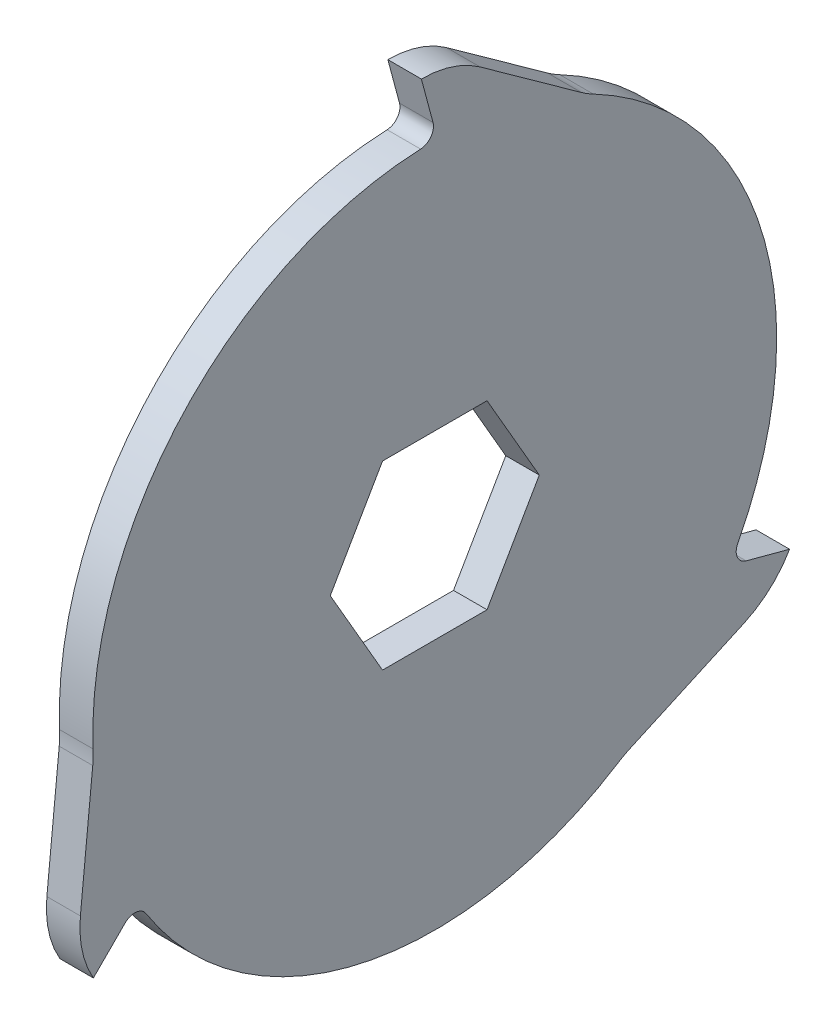
ISO-10303-21;
HEADER;
FILE_DESCRIPTION(('STEP AP214'),'2;1');
FILE_NAME('part.step','',(''),(''),'','','');
FILE_SCHEMA(('AUTOMOTIVE_DESIGN { 1 0 10303 214 1 1 1 1 }'));
ENDSEC;
DATA;
#1=APPLICATION_CONTEXT('core data for automotive mechanical design processes');
#2=APPLICATION_PROTOCOL_DEFINITION('international standard','automotive_design',2000,#1);
#3=PRODUCT_CONTEXT('',#1,'mechanical');
#4=PRODUCT('Part','Part','',(#3));
#5=PRODUCT_RELATED_PRODUCT_CATEGORY('part','',(#4));
#6=PRODUCT_DEFINITION_FORMATION('','',#4);
#7=PRODUCT_DEFINITION_CONTEXT('part definition',#1,'design');
#8=PRODUCT_DEFINITION('design','',#6,#7);
#9=PRODUCT_DEFINITION_SHAPE('','',#8);
#10=(LENGTH_UNIT() NAMED_UNIT(*) SI_UNIT(.MILLI.,.METRE.));
#11=(NAMED_UNIT(*) PLANE_ANGLE_UNIT() SI_UNIT($,.RADIAN.));
#12=(NAMED_UNIT(*) SI_UNIT($,.STERADIAN.) SOLID_ANGLE_UNIT());
#13=UNCERTAINTY_MEASURE_WITH_UNIT(LENGTH_MEASURE(1.E-05),#10,'distance_accuracy_value','');
#14=(GEOMETRIC_REPRESENTATION_CONTEXT(3) GLOBAL_UNCERTAINTY_ASSIGNED_CONTEXT((#13)) GLOBAL_UNIT_ASSIGNED_CONTEXT((#10,
#11,#12)) REPRESENTATION_CONTEXT('',''));
#15=CARTESIAN_POINT('',(0.,0.,0.));
#16=DIRECTION('',(0.,0.,1.));
#17=DIRECTION('',(1.,0.,0.));
#18=AXIS2_PLACEMENT_3D('',#15,#16,#17);
#19=CARTESIAN_POINT('',(2.5,0.,0.));
#20=DIRECTION('',(-1.,0.,0.));
#21=DIRECTION('',(0.,0.,1.));
#22=AXIS2_PLACEMENT_3D('',#19,#20,#21);
#23=CYLINDRICAL_SURFACE('',#22,51.);
#24=DIRECTION('',(1.,0.,0.));
#25=VECTOR('',#24,1.);
#26=CARTESIAN_POINT('',(-2.5,-23.6493995953492,-45.1852398331523));
#27=LINE('',#26,#25);
#28=CARTESIAN_POINT('',(-2.5,-23.6493995953492,-45.1852398331523));
#29=VERTEX_POINT('',#28);
#30=CARTESIAN_POINT('',(2.5,-23.6493995953492,-45.1852398331523));
#31=VERTEX_POINT('',#30);
#32=EDGE_CURVE('E248',#29,#31,#27,.T.);
#33=ORIENTED_EDGE('',*,*,#32,.F.);
#34=CARTESIAN_POINT('',(-2.5,0.,0.));
#35=DIRECTION('',(1.,0.,0.));
#36=DIRECTION('',(0.,0.,-1.));
#37=AXIS2_PLACEMENT_3D('',#34,#35,#36);
#38=CIRCLE('',#37,51.);
#39=CARTESIAN_POINT('',(-2.5,45.1852398331523,-23.6493995953494));
#40=VERTEX_POINT('',#39);
#41=EDGE_CURVE('E377',#29,#40,#38,.T.);
#42=ORIENTED_EDGE('',*,*,#41,.T.);
#43=DIRECTION('',(1.,0.,0.));
#44=VECTOR('',#43,1.);
#45=CARTESIAN_POINT('',(-2.5,45.1852398331523,-23.6493995953494));
#46=LINE('',#45,#44);
#47=CARTESIAN_POINT('',(2.5,45.1852398331523,-23.6493995953494));
#48=VERTEX_POINT('',#47);
#49=EDGE_CURVE('E326',#40,#48,#46,.T.);
#50=ORIENTED_EDGE('',*,*,#49,.T.);
#51=CARTESIAN_POINT('',(2.5,0.,0.));
#52=DIRECTION('',(1.,0.,0.));
#53=DIRECTION('',(0.,0.,-1.));
#54=AXIS2_PLACEMENT_3D('',#51,#52,#53);
#55=CIRCLE('',#54,51.);
#56=EDGE_CURVE('E43',#31,#48,#55,.T.);
#57=ORIENTED_EDGE('',*,*,#56,.F.);
#58=EDGE_LOOP('',(#33,#42,#50,#57));
#59=FACE_BOUND('',#58,.T.);
#60=ADVANCED_FACE('F33',(#59),#23,.T.);
#61=CARTESIAN_POINT('',(-2.5,-27.3068657739276,43.0736007503981));
#62=VERTEX_POINT('',#61);
#63=CARTESIAN_POINT('',(-2.5,-43.0736007503979,-27.3068657739281));
#64=VERTEX_POINT('',#63);
#65=EDGE_CURVE('E380',#62,#64,#38,.T.);
#66=ORIENTED_EDGE('',*,*,#65,.T.);
#67=DIRECTION('',(1.,0.,0.));
#68=VECTOR('',#67,1.);
#69=CARTESIAN_POINT('',(-2.5,-43.0736007503979,-27.3068657739281));
#70=LINE('',#69,#68);
#71=CARTESIAN_POINT('',(2.5,-43.0736007503979,-27.3068657739281));
#72=VERTEX_POINT('',#71);
#73=EDGE_CURVE('E57',#64,#72,#70,.T.);
#74=ORIENTED_EDGE('',*,*,#73,.T.);
#75=CARTESIAN_POINT('',(2.5,-27.3068657739276,43.0736007503981));
#76=VERTEX_POINT('',#75);
#77=EDGE_CURVE('E42',#76,#72,#55,.T.);
#78=ORIENTED_EDGE('',*,*,#77,.F.);
#79=DIRECTION('',(1.,0.,0.));
#80=VECTOR('',#79,1.);
#81=CARTESIAN_POINT('',(-2.5,-27.3068657739276,43.0736007503981));
#82=LINE('',#81,#80);
#83=EDGE_CURVE('E287',#62,#76,#82,.T.);
#84=ORIENTED_EDGE('',*,*,#83,.F.);
#85=EDGE_LOOP('',(#66,#74,#78,#84));
#86=FACE_BOUND('',#85,.T.);
#87=ADVANCED_FACE('F402',(#86),#23,.T.);
#88=CARTESIAN_POINT('',(2.5,0.,0.));
#89=DIRECTION('',(1.,0.,0.));
#90=DIRECTION('',(0.,0.,-1.));
#91=AXIS2_PLACEMENT_3D('',#88,#89,#90);
#92=PLANE('',#91);
#93=CARTESIAN_POINT('',(2.5,50.9562653692771,2.11163908275383));
#94=VERTEX_POINT('',#93);
#95=CARTESIAN_POINT('',(2.5,-2.11163908275438,50.9562653692771));
#96=VERTEX_POINT('',#95);
#97=EDGE_CURVE('E11',#94,#96,#55,.T.);
#98=ORIENTED_EDGE('',*,*,#97,.T.);
#99=CARTESIAN_POINT('',(2.5,-2.73270940121155,65.9434022425939));
#100=DIRECTION('',(-1.,0.,0.));
#101=DIRECTION('',(0.,0.866025403784436,0.500000000000004));
#102=AXIS2_PLACEMENT_3D('',#99,#100,#101);
#103=CIRCLE('',#102,15.);
#104=CARTESIAN_POINT('',(2.5,-4.21867035780101,51.0171863780322));
#105=VERTEX_POINT('',#104);
#106=EDGE_CURVE('E274',#96,#105,#103,.T.);
#107=ORIENTED_EDGE('',*,*,#106,.T.);
#108=DIRECTION('',(0.,-0.995081057637443,0.0990640637726311));
#109=VECTOR('',#108,1.);
#110=CARTESIAN_POINT('',(2.5,-4.21867035780101,51.0171863780322));
#111=LINE('',#110,#109);
#112=CARTESIAN_POINT('',(2.5,-22.7242225356181,52.8594837336301));
#113=VERTEX_POINT('',#112);
#114=EDGE_CURVE('E255',#105,#113,#111,.T.);
#115=ORIENTED_EDGE('',*,*,#114,.T.);
#116=CARTESIAN_POINT('',(2.5,-24.2101834922076,37.9332678690685));
#117=DIRECTION('',(1.,0.,0.));
#118=DIRECTION('',(0.,-0.866025403784436,-0.500000000000004));
#119=AXIS2_PLACEMENT_3D('',#116,#117,#118);
#120=CIRCLE('',#119,15.);
#121=CARTESIAN_POINT('',(2.5,-31.7101834922077,50.923648925835));
#122=VERTEX_POINT('',#121);
#123=EDGE_CURVE('E244',#113,#122,#120,.T.);
#124=ORIENTED_EDGE('',*,*,#123,.T.);
#125=DIRECTION('',(0.,0.707106781186547,-0.707106781186548));
#126=VECTOR('',#125,1.);
#127=CARTESIAN_POINT('',(2.5,-31.7101834922077,50.923648925835));
#128=LINE('',#127,#126);
#129=CARTESIAN_POINT('',(2.5,-26.963509692885,46.1769751265124));
#130=VERTEX_POINT('',#129);
#131=EDGE_CURVE('E269',#122,#130,#128,.T.);
#132=ORIENTED_EDGE('',*,*,#131,.T.);
#133=CARTESIAN_POINT('',(2.5,-28.3777232552581,44.7627615641393));
#134=DIRECTION('',(-1.,0.,0.));
#135=DIRECTION('',(0.,-0.866025403784436,-0.500000000000004));
#136=AXIS2_PLACEMENT_3D('',#133,#134,#135);
#137=CIRCLE('',#136,2.);
#138=EDGE_CURVE('E272',#130,#76,#137,.T.);
#139=ORIENTED_EDGE('',*,*,#138,.T.);
#140=ORIENTED_EDGE('',*,*,#77,.T.);
#141=CARTESIAN_POINT('',(2.5,-55.742306853456,-35.3382968839069));
#142=DIRECTION('',(-1.,0.,0.));
#143=DIRECTION('',(0.,-0.866025403784443,0.499999999999992));
#144=AXIS2_PLACEMENT_3D('',#141,#142,#143);
#145=CIRCLE('',#144,15.);
#146=CARTESIAN_POINT('',(2.5,-42.0728442540807,-29.1620688890644));
#147=VERTEX_POINT('',#146);
#148=EDGE_CURVE('E227',#72,#147,#145,.T.);
#149=ORIENTED_EDGE('',*,*,#148,.T.);
#150=DIRECTION('',(0.,0.411748532989506,-0.911297506625026));
#151=VECTOR('',#150,1.);
#152=CARTESIAN_POINT('',(2.5,-42.0728442540807,-29.1620688890644));
#153=LINE('',#152,#151);
#154=CARTESIAN_POINT('',(2.5,-34.4155444764447,-46.1094958639113));
#155=VERTEX_POINT('',#154);
#156=EDGE_CURVE('E224',#147,#155,#153,.T.);
#157=ORIENTED_EDGE('',*,*,#156,.T.);
#158=CARTESIAN_POINT('',(2.5,-20.7460818770693,-39.9332678690688));
#159=DIRECTION('',(1.,0.,0.));
#160=DIRECTION('',(0.,0.866025403784443,-0.499999999999992));
#161=AXIS2_PLACEMENT_3D('',#158,#159,#160);
#162=CIRCLE('',#161,15.);
#163=CARTESIAN_POINT('',(2.5,-28.2460818770692,-52.9236489258354));
#164=VERTEX_POINT('',#163);
#165=EDGE_CURVE('E235',#155,#164,#162,.T.);
#166=ORIENTED_EDGE('',*,*,#165,.T.);
#167=DIRECTION('',(0.,0.258819045102517,0.965925826289069));
#168=VECTOR('',#167,1.);
#169=CARTESIAN_POINT('',(2.5,-28.2460818770692,-52.9236489258354));
#170=LINE('',#169,#168);
#171=CARTESIAN_POINT('',(2.5,-26.5086786830391,-46.4395719324827));
#172=VERTEX_POINT('',#171);
#173=EDGE_CURVE('E202',#164,#172,#170,.T.);
#174=ORIENTED_EDGE('',*,*,#173,.T.);
#175=CARTESIAN_POINT('',(2.5,-24.576827030461,-46.9572100226877));
#176=DIRECTION('',(-1.,0.,0.));
#177=DIRECTION('',(0.,0.866025403784443,-0.499999999999992));
#178=AXIS2_PLACEMENT_3D('',#175,#176,#177);
#179=CIRCLE('',#178,2.);
#180=EDGE_CURVE('E238',#172,#31,#179,.T.);
#181=ORIENTED_EDGE('',*,*,#180,.T.);
#182=ORIENTED_EDGE('',*,*,#56,.T.);
#183=CARTESIAN_POINT('',(2.5,58.4750162546676,-30.6051053586874));
#184=DIRECTION('',(-1.,0.,0.));
#185=DIRECTION('',(0.,0.,-1.));
#186=AXIS2_PLACEMENT_3D('',#183,#184,#185);
#187=CIRCLE('',#186,15.);
#188=CARTESIAN_POINT('',(2.5,46.2915146118817,-21.8551174889683));
#189=VERTEX_POINT('',#188);
#190=EDGE_CURVE('E316',#48,#189,#187,.T.);
#191=ORIENTED_EDGE('',*,*,#190,.T.);
#192=DIRECTION('',(0.,0.583332524647945,0.812233442852395));
#193=VECTOR('',#192,1.);
#194=CARTESIAN_POINT('',(2.5,46.2915146118817,-21.8551174889683));
#195=LINE('',#194,#193);
#196=CARTESIAN_POINT('',(2.5,57.139767012063,-6.74998786971918));
#197=VERTEX_POINT('',#196);
#198=EDGE_CURVE('E297',#189,#197,#195,.T.);
#199=ORIENTED_EDGE('',*,*,#198,.T.);
#200=CARTESIAN_POINT('',(2.5,44.9562653692771,2.));
#201=DIRECTION('',(1.,0.,0.));
#202=DIRECTION('',(0.,0.,1.));
#203=AXIS2_PLACEMENT_3D('',#200,#201,#202);
#204=CIRCLE('',#203,15.);
#205=CARTESIAN_POINT('',(2.5,59.9562653692771,2.));
#206=VERTEX_POINT('',#205);
#207=EDGE_CURVE('E281',#197,#206,#204,.T.);
#208=ORIENTED_EDGE('',*,*,#207,.T.);
#209=DIRECTION('',(0.,-0.96592582628907,-0.258819045102516));
#210=VECTOR('',#209,1.);
#211=CARTESIAN_POINT('',(2.5,59.9562653692771,2.));
#212=LINE('',#211,#210);
#213=CARTESIAN_POINT('',(2.5,53.4721883759244,0.262596805969956));
#214=VERTEX_POINT('',#213);
#215=EDGE_CURVE('E311',#206,#214,#212,.T.);
#216=ORIENTED_EDGE('',*,*,#215,.T.);
#217=CARTESIAN_POINT('',(2.5,52.9545502857193,2.1944484585481));
#218=DIRECTION('',(-1.,0.,0.));
#219=DIRECTION('',(0.,0.,1.));
#220=AXIS2_PLACEMENT_3D('',#217,#218,#219);
#221=CIRCLE('',#220,2.);
#222=EDGE_CURVE('E314',#214,#94,#221,.T.);
#223=ORIENTED_EDGE('',*,*,#222,.T.);
#224=EDGE_LOOP('',(#98,#107,#115,#124,#132,#139,#140,#149,#157,#166,#174,#181,#182,#191,#199,
#208,#216,#223));
#225=FACE_BOUND('',#224,.T.);
#226=DIRECTION('',(0.,0.,1.));
#227=VECTOR('',#226,1.);
#228=CARTESIAN_POINT('',(2.5,13.5000000000001,-7.79422863405985));
#229=LINE('',#228,#227);
#230=CARTESIAN_POINT('',(2.5,13.5000000000001,-7.79422863405985));
#231=VERTEX_POINT('',#230);
#232=CARTESIAN_POINT('',(2.5,13.5,7.79422863406004));
#233=VERTEX_POINT('',#232);
#234=EDGE_CURVE('E336',#231,#233,#229,.T.);
#235=ORIENTED_EDGE('',*,*,#234,.F.);
#236=DIRECTION('',(0.,0.866025403784435,0.500000000000006));
#237=VECTOR('',#236,1.);
#238=CARTESIAN_POINT('',(2.5,1.07654099147427E-13,-15.5884572681199));
#239=LINE('',#238,#237);
#240=CARTESIAN_POINT('',(2.5,1.07654099147427E-13,-15.5884572681199));
#241=VERTEX_POINT('',#240);
#242=EDGE_CURVE('E334',#241,#231,#239,.T.);
#243=ORIENTED_EDGE('',*,*,#242,.F.);
#244=DIRECTION('',(0.,0.866025403784442,-0.499999999999994));
#245=VECTOR('',#244,1.);
#246=CARTESIAN_POINT('',(2.5,-13.4999999999999,-7.79422863406004));
#247=LINE('',#246,#245);
#248=CARTESIAN_POINT('',(2.5,-13.4999999999999,-7.79422863406004));
#249=VERTEX_POINT('',#248);
#250=EDGE_CURVE('E346',#249,#241,#247,.T.);
#251=ORIENTED_EDGE('',*,*,#250,.F.);
#252=DIRECTION('',(0.,0.,-1.));
#253=VECTOR('',#252,1.);
#254=CARTESIAN_POINT('',(2.5,-13.5000000000001,7.79422863405985));
#255=LINE('',#254,#253);
#256=CARTESIAN_POINT('',(2.5,-13.5000000000001,7.79422863405985));
#257=VERTEX_POINT('',#256);
#258=EDGE_CURVE('E343',#257,#249,#255,.T.);
#259=ORIENTED_EDGE('',*,*,#258,.F.);
#260=DIRECTION('',(0.,-0.866025403784435,-0.500000000000006));
#261=VECTOR('',#260,1.);
#262=CARTESIAN_POINT('',(2.5,-1.07406748848681E-13,15.5884572681199));
#263=LINE('',#262,#261);
#264=CARTESIAN_POINT('',(2.5,-1.07406748848681E-13,15.5884572681199));
#265=VERTEX_POINT('',#264);
#266=EDGE_CURVE('E341',#265,#257,#263,.T.);
#267=ORIENTED_EDGE('',*,*,#266,.F.);
#268=DIRECTION('',(0.,-0.866025403784442,0.499999999999994));
#269=VECTOR('',#268,1.);
#270=CARTESIAN_POINT('',(2.5,13.5,7.79422863406004));
#271=LINE('',#270,#269);
#272=EDGE_CURVE('E339',#233,#265,#271,.T.);
#273=ORIENTED_EDGE('',*,*,#272,.F.);
#274=EDGE_LOOP('',(#235,#243,#251,#259,#267,#273));
#275=FACE_BOUND('',#274,.T.);
#276=ADVANCED_FACE('F388',(#225,#275),#92,.T.);
#277=CARTESIAN_POINT('',(-2.5,0.,0.));
#278=DIRECTION('',(1.,0.,0.));
#279=DIRECTION('',(0.,0.,-1.));
#280=AXIS2_PLACEMENT_3D('',#277,#278,#279);
#281=PLANE('',#280);
#282=CARTESIAN_POINT('',(-2.5,50.9562653692771,2.11163908275383));
#283=VERTEX_POINT('',#282);
#284=CARTESIAN_POINT('',(-2.5,-2.11163908275438,50.9562653692771));
#285=VERTEX_POINT('',#284);
#286=EDGE_CURVE('E37',#283,#285,#38,.T.);
#287=ORIENTED_EDGE('',*,*,#286,.F.);
#288=CARTESIAN_POINT('',(-2.5,52.9545502857193,2.1944484585481));
#289=DIRECTION('',(-1.,0.,0.));
#290=DIRECTION('',(0.,0.,1.));
#291=AXIS2_PLACEMENT_3D('',#288,#289,#290);
#292=CIRCLE('',#291,2.);
#293=CARTESIAN_POINT('',(-2.5,53.4721883759244,0.262596805969956));
#294=VERTEX_POINT('',#293);
#295=EDGE_CURVE('E300',#294,#283,#292,.T.);
#296=ORIENTED_EDGE('',*,*,#295,.F.);
#297=DIRECTION('',(0.,-0.96592582628907,-0.258819045102516));
#298=VECTOR('',#297,1.);
#299=CARTESIAN_POINT('',(-2.5,59.9562653692771,2.));
#300=LINE('',#299,#298);
#301=CARTESIAN_POINT('',(-2.5,59.9562653692771,2.));
#302=VERTEX_POINT('',#301);
#303=EDGE_CURVE('E296',#302,#294,#300,.T.);
#304=ORIENTED_EDGE('',*,*,#303,.F.);
#305=CARTESIAN_POINT('',(-2.5,44.9562653692771,2.));
#306=DIRECTION('',(1.,0.,0.));
#307=DIRECTION('',(0.,0.,1.));
#308=AXIS2_PLACEMENT_3D('',#305,#306,#307);
#309=CIRCLE('',#308,15.);
#310=CARTESIAN_POINT('',(-2.5,57.139767012063,-6.74998786971918));
#311=VERTEX_POINT('',#310);
#312=EDGE_CURVE('E293',#311,#302,#309,.T.);
#313=ORIENTED_EDGE('',*,*,#312,.F.);
#314=DIRECTION('',(0.,0.583332524647945,0.812233442852395));
#315=VECTOR('',#314,1.);
#316=CARTESIAN_POINT('',(-2.5,46.2915146118817,-21.8551174889683));
#317=LINE('',#316,#315);
#318=CARTESIAN_POINT('',(-2.5,46.2915146118817,-21.8551174889683));
#319=VERTEX_POINT('',#318);
#320=EDGE_CURVE('E305',#319,#311,#317,.T.);
#321=ORIENTED_EDGE('',*,*,#320,.F.);
#322=CARTESIAN_POINT('',(-2.5,58.4750162546676,-30.6051053586874));
#323=DIRECTION('',(-1.,0.,0.));
#324=DIRECTION('',(0.,0.,-1.));
#325=AXIS2_PLACEMENT_3D('',#322,#323,#324);
#326=CIRCLE('',#325,15.);
#327=EDGE_CURVE('E302',#40,#319,#326,.T.);
#328=ORIENTED_EDGE('',*,*,#327,.F.);
#329=ORIENTED_EDGE('',*,*,#41,.F.);
#330=CARTESIAN_POINT('',(-2.5,-24.576827030461,-46.9572100226877));
#331=DIRECTION('',(-1.,0.,0.));
#332=DIRECTION('',(0.,0.866025403784443,-0.499999999999992));
#333=AXIS2_PLACEMENT_3D('',#330,#331,#332);
#334=CIRCLE('',#333,2.);
#335=CARTESIAN_POINT('',(-2.5,-26.5086786830391,-46.4395719324827));
#336=VERTEX_POINT('',#335);
#337=EDGE_CURVE('E220',#336,#29,#334,.T.);
#338=ORIENTED_EDGE('',*,*,#337,.F.);
#339=DIRECTION('',(0.,0.258819045102517,0.965925826289069));
#340=VECTOR('',#339,1.);
#341=CARTESIAN_POINT('',(-2.5,-28.2460818770692,-52.9236489258354));
#342=LINE('',#341,#340);
#343=CARTESIAN_POINT('',(-2.5,-28.2460818770692,-52.9236489258354));
#344=VERTEX_POINT('',#343);
#345=EDGE_CURVE('E200',#344,#336,#342,.T.);
#346=ORIENTED_EDGE('',*,*,#345,.F.);
#347=CARTESIAN_POINT('',(-2.5,-20.7460818770693,-39.9332678690688));
#348=DIRECTION('',(1.,0.,0.));
#349=DIRECTION('',(0.,0.866025403784443,-0.499999999999992));
#350=AXIS2_PLACEMENT_3D('',#347,#348,#349);
#351=CIRCLE('',#350,15.);
#352=CARTESIAN_POINT('',(-2.5,-34.4155444764447,-46.1094958639113));
#353=VERTEX_POINT('',#352);
#354=EDGE_CURVE('E217',#353,#344,#351,.T.);
#355=ORIENTED_EDGE('',*,*,#354,.F.);
#356=DIRECTION('',(0.,0.411748532989506,-0.911297506625026));
#357=VECTOR('',#356,1.);
#358=CARTESIAN_POINT('',(-2.5,-42.0728442540807,-29.1620688890644));
#359=LINE('',#358,#357);
#360=CARTESIAN_POINT('',(-2.5,-42.0728442540807,-29.1620688890644));
#361=VERTEX_POINT('',#360);
#362=EDGE_CURVE('E208',#361,#353,#359,.T.);
#363=ORIENTED_EDGE('',*,*,#362,.F.);
#364=CARTESIAN_POINT('',(-2.5,-55.742306853456,-35.3382968839069));
#365=DIRECTION('',(-1.,0.,0.));
#366=DIRECTION('',(0.,-0.866025403784443,0.499999999999992));
#367=AXIS2_PLACEMENT_3D('',#364,#365,#366);
#368=CIRCLE('',#367,15.);
#369=EDGE_CURVE('E231',#64,#361,#368,.T.);
#370=ORIENTED_EDGE('',*,*,#369,.F.);
#371=ORIENTED_EDGE('',*,*,#65,.F.);
#372=CARTESIAN_POINT('',(-2.5,-28.3777232552581,44.7627615641393));
#373=DIRECTION('',(-1.,0.,0.));
#374=DIRECTION('',(0.,-0.866025403784436,-0.500000000000004));
#375=AXIS2_PLACEMENT_3D('',#372,#373,#374);
#376=CIRCLE('',#375,2.);
#377=CARTESIAN_POINT('',(-2.5,-26.963509692885,46.1769751265124));
#378=VERTEX_POINT('',#377);
#379=EDGE_CURVE('E258',#378,#62,#376,.T.);
#380=ORIENTED_EDGE('',*,*,#379,.F.);
#381=DIRECTION('',(0.,0.707106781186547,-0.707106781186548));
#382=VECTOR('',#381,1.);
#383=CARTESIAN_POINT('',(-2.5,-31.7101834922077,50.923648925835));
#384=LINE('',#383,#382);
#385=CARTESIAN_POINT('',(-2.5,-31.7101834922077,50.923648925835));
#386=VERTEX_POINT('',#385);
#387=EDGE_CURVE('E254',#386,#378,#384,.T.);
#388=ORIENTED_EDGE('',*,*,#387,.F.);
#389=CARTESIAN_POINT('',(-2.5,-24.2101834922076,37.9332678690685));
#390=DIRECTION('',(1.,0.,0.));
#391=DIRECTION('',(0.,-0.866025403784436,-0.500000000000004));
#392=AXIS2_PLACEMENT_3D('',#389,#390,#391);
#393=CIRCLE('',#392,15.);
#394=CARTESIAN_POINT('',(-2.5,-22.7242225356181,52.8594837336301));
#395=VERTEX_POINT('',#394);
#396=EDGE_CURVE('E251',#395,#386,#393,.T.);
#397=ORIENTED_EDGE('',*,*,#396,.F.);
#398=DIRECTION('',(0.,-0.995081057637443,0.0990640637726311));
#399=VECTOR('',#398,1.);
#400=CARTESIAN_POINT('',(-2.5,-4.21867035780101,51.0171863780322));
#401=LINE('',#400,#399);
#402=CARTESIAN_POINT('',(-2.5,-4.21867035780101,51.0171863780322));
#403=VERTEX_POINT('',#402);
#404=EDGE_CURVE('E263',#403,#395,#401,.T.);
#405=ORIENTED_EDGE('',*,*,#404,.F.);
#406=CARTESIAN_POINT('',(-2.5,-2.73270940121155,65.9434022425939));
#407=DIRECTION('',(-1.,0.,0.));
#408=DIRECTION('',(0.,0.866025403784436,0.500000000000004));
#409=AXIS2_PLACEMENT_3D('',#406,#407,#408);
#410=CIRCLE('',#409,15.);
#411=EDGE_CURVE('E260',#285,#403,#410,.T.);
#412=ORIENTED_EDGE('',*,*,#411,.F.);
#413=EDGE_LOOP('',(#287,#296,#304,#313,#321,#328,#329,#338,#346,#355,#363,#370,#371,#380,#388,
#397,#405,#412));
#414=FACE_BOUND('',#413,.T.);
#415=DIRECTION('',(0.,0.866025403784435,0.500000000000006));
#416=VECTOR('',#415,1.);
#417=CARTESIAN_POINT('',(-2.5,1.07654099147427E-13,-15.5884572681199));
#418=LINE('',#417,#416);
#419=CARTESIAN_POINT('',(-2.5,1.06685493772574E-13,-15.5884572681199));
#420=VERTEX_POINT('',#419);
#421=CARTESIAN_POINT('',(-2.5,13.5000000000001,-7.79422863405985));
#422=VERTEX_POINT('',#421);
#423=EDGE_CURVE('E323',#420,#422,#418,.T.);
#424=ORIENTED_EDGE('',*,*,#423,.T.);
#425=DIRECTION('',(0.,0.,1.));
#426=VECTOR('',#425,1.);
#427=CARTESIAN_POINT('',(-2.5,13.5000000000001,-7.79422863405985));
#428=LINE('',#427,#426);
#429=CARTESIAN_POINT('',(-2.5,13.5,7.79422863406004));
#430=VERTEX_POINT('',#429);
#431=EDGE_CURVE('E351',#422,#430,#428,.T.);
#432=ORIENTED_EDGE('',*,*,#431,.T.);
#433=DIRECTION('',(0.,-0.866025403784442,0.499999999999994));
#434=VECTOR('',#433,1.);
#435=CARTESIAN_POINT('',(-2.5,13.5,7.79422863406004));
#436=LINE('',#435,#434);
#437=CARTESIAN_POINT('',(-2.5,-1.07406748848681E-13,15.5884572681199));
#438=VERTEX_POINT('',#437);
#439=EDGE_CURVE('E354',#430,#438,#436,.T.);
#440=ORIENTED_EDGE('',*,*,#439,.T.);
#441=DIRECTION('',(0.,-0.866025403784435,-0.500000000000006));
#442=VECTOR('',#441,1.);
#443=CARTESIAN_POINT('',(-2.5,-1.07406748848681E-13,15.5884572681199));
#444=LINE('',#443,#442);
#445=CARTESIAN_POINT('',(-2.5,-13.5000000000001,7.79422863405985));
#446=VERTEX_POINT('',#445);
#447=EDGE_CURVE('E357',#438,#446,#444,.T.);
#448=ORIENTED_EDGE('',*,*,#447,.T.);
#449=DIRECTION('',(0.,0.,-1.));
#450=VECTOR('',#449,1.);
#451=CARTESIAN_POINT('',(-2.5,-13.5000000000001,7.79422863405985));
#452=LINE('',#451,#450);
#453=CARTESIAN_POINT('',(-2.5,-13.4999999999999,-7.79422863406004));
#454=VERTEX_POINT('',#453);
#455=EDGE_CURVE('E360',#446,#454,#452,.T.);
#456=ORIENTED_EDGE('',*,*,#455,.T.);
#457=DIRECTION('',(0.,0.866025403784442,-0.499999999999994));
#458=VECTOR('',#457,1.);
#459=CARTESIAN_POINT('',(-2.5,-13.4999999999999,-7.79422863406004));
#460=LINE('',#459,#458);
#461=EDGE_CURVE('E337',#454,#420,#460,.T.);
#462=ORIENTED_EDGE('',*,*,#461,.T.);
#463=EDGE_LOOP('',(#424,#432,#440,#448,#456,#462));
#464=FACE_BOUND('',#463,.T.);
#465=ADVANCED_FACE('F214',(#414,#464),#281,.F.);
#466=ORIENTED_EDGE('',*,*,#286,.T.);
#467=DIRECTION('',(1.,0.,0.));
#468=VECTOR('',#467,1.);
#469=CARTESIAN_POINT('',(-2.5,-2.11163908275438,50.9562653692771));
#470=LINE('',#469,#468);
#471=EDGE_CURVE('E284',#285,#96,#470,.T.);
#472=ORIENTED_EDGE('',*,*,#471,.T.);
#473=ORIENTED_EDGE('',*,*,#97,.F.);
#474=DIRECTION('',(1.,0.,0.));
#475=VECTOR('',#474,1.);
#476=CARTESIAN_POINT('',(-2.5,50.9562653692771,2.11163908275383));
#477=LINE('',#476,#475);
#478=EDGE_CURVE('E328',#283,#94,#477,.T.);
#479=ORIENTED_EDGE('',*,*,#478,.F.);
#480=EDGE_LOOP('',(#466,#472,#473,#479));
#481=FACE_BOUND('',#480,.T.);
#482=ADVANCED_FACE('F35',(#481),#23,.T.);
#483=CARTESIAN_POINT('',(2.5,1.07654099147427E-13,-15.5884572681199));
#484=DIRECTION('',(0.,-0.500000000000006,0.866025403784435));
#485=DIRECTION('',(0.,-0.866025403784435,-0.500000000000006));
#486=AXIS2_PLACEMENT_3D('',#483,#484,#485);
#487=PLANE('',#486);
#488=ORIENTED_EDGE('',*,*,#423,.F.);
#489=DIRECTION('',(-1.,0.,0.));
#490=VECTOR('',#489,1.);
#491=CARTESIAN_POINT('',(2.5,1.07654099147427E-13,-15.5884572681199));
#492=LINE('',#491,#490);
#493=EDGE_CURVE('E348',#241,#420,#492,.T.);
#494=ORIENTED_EDGE('',*,*,#493,.F.);
#495=ORIENTED_EDGE('',*,*,#242,.T.);
#496=DIRECTION('',(-1.,0.,0.));
#497=VECTOR('',#496,1.);
#498=CARTESIAN_POINT('',(2.5,13.5000000000001,-7.79422863405985));
#499=LINE('',#498,#497);
#500=EDGE_CURVE('E375',#231,#422,#499,.T.);
#501=ORIENTED_EDGE('',*,*,#500,.T.);
#502=EDGE_LOOP('',(#488,#494,#495,#501));
#503=FACE_BOUND('',#502,.T.);
#504=ADVANCED_FACE('F407',(#503),#487,.T.);
#505=CARTESIAN_POINT('',(2.5,13.5000000000001,-7.79422863405985));
#506=DIRECTION('',(0.,-1.,0.));
#507=DIRECTION('',(0.,0.,-1.));
#508=AXIS2_PLACEMENT_3D('',#505,#506,#507);
#509=PLANE('',#508);
#510=ORIENTED_EDGE('',*,*,#431,.F.);
#511=ORIENTED_EDGE('',*,*,#500,.F.);
#512=ORIENTED_EDGE('',*,*,#234,.T.);
#513=DIRECTION('',(-1.,0.,0.));
#514=VECTOR('',#513,1.);
#515=CARTESIAN_POINT('',(2.5,13.5,7.79422863406004));
#516=LINE('',#515,#514);
#517=EDGE_CURVE('E373',#233,#430,#516,.T.);
#518=ORIENTED_EDGE('',*,*,#517,.T.);
#519=EDGE_LOOP('',(#510,#511,#512,#518));
#520=FACE_BOUND('',#519,.T.);
#521=ADVANCED_FACE('F412',(#520),#509,.T.);
#522=CARTESIAN_POINT('',(2.5,13.5,7.79422863406004));
#523=DIRECTION('',(0.,-0.499999999999994,-0.866025403784442));
#524=DIRECTION('',(0.,0.866025403784442,-0.499999999999994));
#525=AXIS2_PLACEMENT_3D('',#522,#523,#524);
#526=PLANE('',#525);
#527=ORIENTED_EDGE('',*,*,#439,.F.);
#528=ORIENTED_EDGE('',*,*,#517,.F.);
#529=ORIENTED_EDGE('',*,*,#272,.T.);
#530=DIRECTION('',(-1.,0.,0.));
#531=VECTOR('',#530,1.);
#532=CARTESIAN_POINT('',(2.5,-1.07406748848681E-13,15.5884572681199));
#533=LINE('',#532,#531);
#534=EDGE_CURVE('E371',#265,#438,#533,.T.);
#535=ORIENTED_EDGE('',*,*,#534,.T.);
#536=EDGE_LOOP('',(#527,#528,#529,#535));
#537=FACE_BOUND('',#536,.T.);
#538=ADVANCED_FACE('F421',(#537),#526,.T.);
#539=CARTESIAN_POINT('',(2.5,-1.07406748848681E-13,15.5884572681199));
#540=DIRECTION('',(0.,0.500000000000006,-0.866025403784435));
#541=DIRECTION('',(0.,0.866025403784435,0.500000000000006));
#542=AXIS2_PLACEMENT_3D('',#539,#540,#541);
#543=PLANE('',#542);
#544=ORIENTED_EDGE('',*,*,#447,.F.);
#545=ORIENTED_EDGE('',*,*,#534,.F.);
#546=ORIENTED_EDGE('',*,*,#266,.T.);
#547=DIRECTION('',(-1.,0.,0.));
#548=VECTOR('',#547,1.);
#549=CARTESIAN_POINT('',(2.5,-13.5000000000001,7.79422863405985));
#550=LINE('',#549,#548);
#551=EDGE_CURVE('E369',#257,#446,#550,.T.);
#552=ORIENTED_EDGE('',*,*,#551,.T.);
#553=EDGE_LOOP('',(#544,#545,#546,#552));
#554=FACE_BOUND('',#553,.T.);
#555=ADVANCED_FACE('F425',(#554),#543,.T.);
#556=CARTESIAN_POINT('',(2.5,-13.5000000000001,7.79422863405985));
#557=DIRECTION('',(0.,1.,0.));
#558=DIRECTION('',(0.,0.,1.));
#559=AXIS2_PLACEMENT_3D('',#556,#557,#558);
#560=PLANE('',#559);
#561=ORIENTED_EDGE('',*,*,#455,.F.);
#562=ORIENTED_EDGE('',*,*,#551,.F.);
#563=ORIENTED_EDGE('',*,*,#258,.T.);
#564=DIRECTION('',(-1.,0.,0.));
#565=VECTOR('',#564,1.);
#566=CARTESIAN_POINT('',(2.5,-13.4999999999999,-7.79422863406004));
#567=LINE('',#566,#565);
#568=EDGE_CURVE('E367',#249,#454,#567,.T.);
#569=ORIENTED_EDGE('',*,*,#568,.T.);
#570=EDGE_LOOP('',(#561,#562,#563,#569));
#571=FACE_BOUND('',#570,.T.);
#572=ADVANCED_FACE('F429',(#571),#560,.T.);
#573=CARTESIAN_POINT('',(2.5,-13.4999999999999,-7.79422863406004));
#574=DIRECTION('',(0.,0.499999999999994,0.866025403784442));
#575=DIRECTION('',(0.,-0.866025403784442,0.499999999999994));
#576=AXIS2_PLACEMENT_3D('',#573,#574,#575);
#577=PLANE('',#576);
#578=ORIENTED_EDGE('',*,*,#461,.F.);
#579=ORIENTED_EDGE('',*,*,#568,.F.);
#580=ORIENTED_EDGE('',*,*,#250,.T.);
#581=ORIENTED_EDGE('',*,*,#493,.T.);
#582=EDGE_LOOP('',(#578,#579,#580,#581));
#583=FACE_BOUND('',#582,.T.);
#584=ADVANCED_FACE('F433',(#583),#577,.T.);
#585=CARTESIAN_POINT('',(-2.5,44.9562653692771,2.));
#586=DIRECTION('',(1.,0.,0.));
#587=DIRECTION('',(0.,0.,-1.));
#588=AXIS2_PLACEMENT_3D('',#585,#586,#587);
#589=CYLINDRICAL_SURFACE('',#588,15.);
#590=ORIENTED_EDGE('',*,*,#207,.F.);
#591=DIRECTION('',(1.,0.,0.));
#592=VECTOR('',#591,1.);
#593=CARTESIAN_POINT('',(-2.5,57.139767012063,-6.74998786971918));
#594=LINE('',#593,#592);
#595=EDGE_CURVE('E321',#311,#197,#594,.T.);
#596=ORIENTED_EDGE('',*,*,#595,.F.);
#597=ORIENTED_EDGE('',*,*,#312,.T.);
#598=DIRECTION('',(1.,0.,0.));
#599=VECTOR('',#598,1.);
#600=CARTESIAN_POINT('',(-2.5,59.9562653692771,2.));
#601=LINE('',#600,#599);
#602=EDGE_CURVE('E308',#302,#206,#601,.T.);
#603=ORIENTED_EDGE('',*,*,#602,.T.);
#604=EDGE_LOOP('',(#590,#596,#597,#603));
#605=FACE_BOUND('',#604,.T.);
#606=ADVANCED_FACE('F437',(#605),#589,.T.);
#607=CARTESIAN_POINT('',(-2.5,46.2915146118817,-21.8551174889683));
#608=DIRECTION('',(0.,0.812233442852395,-0.583332524647945));
#609=DIRECTION('',(0.,0.583332524647945,0.812233442852395));
#610=AXIS2_PLACEMENT_3D('',#607,#608,#609);
#611=PLANE('',#610);
#612=ORIENTED_EDGE('',*,*,#198,.F.);
#613=DIRECTION('',(1.,0.,0.));
#614=VECTOR('',#613,1.);
#615=CARTESIAN_POINT('',(-2.5,46.2915146118817,-21.8551174889683));
#616=LINE('',#615,#614);
#617=EDGE_CURVE('E324',#319,#189,#616,.T.);
#618=ORIENTED_EDGE('',*,*,#617,.F.);
#619=ORIENTED_EDGE('',*,*,#320,.T.);
#620=ORIENTED_EDGE('',*,*,#595,.T.);
#621=EDGE_LOOP('',(#612,#618,#619,#620));
#622=FACE_BOUND('',#621,.T.);
#623=ADVANCED_FACE('F441',(#622),#611,.T.);
#624=CARTESIAN_POINT('',(-2.5,58.4750162546676,-30.6051053586874));
#625=DIRECTION('',(1.,0.,0.));
#626=DIRECTION('',(0.,0.,-1.));
#627=AXIS2_PLACEMENT_3D('',#624,#625,#626);
#628=CYLINDRICAL_SURFACE('',#627,15.);
#629=ORIENTED_EDGE('',*,*,#190,.F.);
#630=ORIENTED_EDGE('',*,*,#49,.F.);
#631=ORIENTED_EDGE('',*,*,#327,.T.);
#632=ORIENTED_EDGE('',*,*,#617,.T.);
#633=EDGE_LOOP('',(#629,#630,#631,#632));
#634=FACE_BOUND('',#633,.T.);
#635=ADVANCED_FACE('F451',(#634),#628,.F.);
#636=CARTESIAN_POINT('',(-2.5,52.9545502857193,2.1944484585481));
#637=DIRECTION('',(1.,0.,0.));
#638=DIRECTION('',(0.,0.,-1.));
#639=AXIS2_PLACEMENT_3D('',#636,#637,#638);
#640=CYLINDRICAL_SURFACE('',#639,2.);
#641=ORIENTED_EDGE('',*,*,#222,.F.);
#642=DIRECTION('',(1.,0.,0.));
#643=VECTOR('',#642,1.);
#644=CARTESIAN_POINT('',(-2.5,53.4721883759244,0.262596805969956));
#645=LINE('',#644,#643);
#646=EDGE_CURVE('E331',#294,#214,#645,.T.);
#647=ORIENTED_EDGE('',*,*,#646,.F.);
#648=ORIENTED_EDGE('',*,*,#295,.T.);
#649=ORIENTED_EDGE('',*,*,#478,.T.);
#650=EDGE_LOOP('',(#641,#647,#648,#649));
#651=FACE_BOUND('',#650,.T.);
#652=ADVANCED_FACE('F447',(#651),#640,.F.);
#653=CARTESIAN_POINT('',(-2.5,59.9562653692771,2.));
#654=DIRECTION('',(0.,-0.258819045102516,0.96592582628907));
#655=DIRECTION('',(0.,-0.96592582628907,-0.258819045102516));
#656=AXIS2_PLACEMENT_3D('',#653,#654,#655);
#657=PLANE('',#656);
#658=ORIENTED_EDGE('',*,*,#215,.F.);
#659=ORIENTED_EDGE('',*,*,#602,.F.);
#660=ORIENTED_EDGE('',*,*,#303,.T.);
#661=ORIENTED_EDGE('',*,*,#646,.T.);
#662=EDGE_LOOP('',(#658,#659,#660,#661));
#663=FACE_BOUND('',#662,.T.);
#664=ADVANCED_FACE('F443',(#663),#657,.T.);
#665=CARTESIAN_POINT('',(-2.5,-24.2101834922076,37.9332678690685));
#666=DIRECTION('',(1.,0.,0.));
#667=DIRECTION('',(0.,0.,-1.));
#668=AXIS2_PLACEMENT_3D('',#665,#666,#667);
#669=CYLINDRICAL_SURFACE('',#668,15.);
#670=ORIENTED_EDGE('',*,*,#123,.F.);
#671=DIRECTION('',(1.,0.,0.));
#672=VECTOR('',#671,1.);
#673=CARTESIAN_POINT('',(-2.5,-22.7242225356181,52.8594837336301));
#674=LINE('',#673,#672);
#675=EDGE_CURVE('E279',#395,#113,#674,.T.);
#676=ORIENTED_EDGE('',*,*,#675,.F.);
#677=ORIENTED_EDGE('',*,*,#396,.T.);
#678=DIRECTION('',(1.,0.,0.));
#679=VECTOR('',#678,1.);
#680=CARTESIAN_POINT('',(-2.5,-31.7101834922077,50.923648925835));
#681=LINE('',#680,#679);
#682=EDGE_CURVE('E266',#386,#122,#681,.T.);
#683=ORIENTED_EDGE('',*,*,#682,.T.);
#684=EDGE_LOOP('',(#670,#676,#677,#683));
#685=FACE_BOUND('',#684,.T.);
#686=ADVANCED_FACE('F446',(#685),#669,.T.);
#687=CARTESIAN_POINT('',(-2.5,-4.21867035780101,51.0171863780322));
#688=DIRECTION('',(0.,0.099064063772631,0.995081057637443));
#689=DIRECTION('',(0.,-0.995081057637443,0.099064063772631));
#690=AXIS2_PLACEMENT_3D('',#687,#688,#689);
#691=PLANE('',#690);
#692=ORIENTED_EDGE('',*,*,#114,.F.);
#693=DIRECTION('',(1.,0.,0.));
#694=VECTOR('',#693,1.);
#695=CARTESIAN_POINT('',(-2.5,-4.21867035780101,51.0171863780322));
#696=LINE('',#695,#694);
#697=EDGE_CURVE('E282',#403,#105,#696,.T.);
#698=ORIENTED_EDGE('',*,*,#697,.F.);
#699=ORIENTED_EDGE('',*,*,#404,.T.);
#700=ORIENTED_EDGE('',*,*,#675,.T.);
#701=EDGE_LOOP('',(#692,#698,#699,#700));
#702=FACE_BOUND('',#701,.T.);
#703=ADVANCED_FACE('F461',(#702),#691,.T.);
#704=CARTESIAN_POINT('',(-2.5,-2.73270940121155,65.9434022425939));
#705=DIRECTION('',(1.,0.,0.));
#706=DIRECTION('',(0.,0.,-1.));
#707=AXIS2_PLACEMENT_3D('',#704,#705,#706);
#708=CYLINDRICAL_SURFACE('',#707,15.);
#709=ORIENTED_EDGE('',*,*,#106,.F.);
#710=ORIENTED_EDGE('',*,*,#471,.F.);
#711=ORIENTED_EDGE('',*,*,#411,.T.);
#712=ORIENTED_EDGE('',*,*,#697,.T.);
#713=EDGE_LOOP('',(#709,#710,#711,#712));
#714=FACE_BOUND('',#713,.T.);
#715=ADVANCED_FACE('F470',(#714),#708,.F.);
#716=CARTESIAN_POINT('',(-2.5,-28.3777232552581,44.7627615641393));
#717=DIRECTION('',(1.,0.,0.));
#718=DIRECTION('',(0.,0.,-1.));
#719=AXIS2_PLACEMENT_3D('',#716,#717,#718);
#720=CYLINDRICAL_SURFACE('',#719,2.);
#721=ORIENTED_EDGE('',*,*,#138,.F.);
#722=DIRECTION('',(1.,0.,0.));
#723=VECTOR('',#722,1.);
#724=CARTESIAN_POINT('',(-2.5,-26.963509692885,46.1769751265124));
#725=LINE('',#724,#723);
#726=EDGE_CURVE('E290',#378,#130,#725,.T.);
#727=ORIENTED_EDGE('',*,*,#726,.F.);
#728=ORIENTED_EDGE('',*,*,#379,.T.);
#729=ORIENTED_EDGE('',*,*,#83,.T.);
#730=EDGE_LOOP('',(#721,#727,#728,#729));
#731=FACE_BOUND('',#730,.T.);
#732=ADVANCED_FACE('F466',(#731),#720,.F.);
#733=CARTESIAN_POINT('',(-2.5,-31.7101834922077,50.923648925835));
#734=DIRECTION('',(0.,-0.707106781186548,-0.707106781186547));
#735=DIRECTION('',(0.,0.707106781186547,-0.707106781186548));
#736=AXIS2_PLACEMENT_3D('',#733,#734,#735);
#737=PLANE('',#736);
#738=ORIENTED_EDGE('',*,*,#131,.F.);
#739=ORIENTED_EDGE('',*,*,#682,.F.);
#740=ORIENTED_EDGE('',*,*,#387,.T.);
#741=ORIENTED_EDGE('',*,*,#726,.T.);
#742=EDGE_LOOP('',(#738,#739,#740,#741));
#743=FACE_BOUND('',#742,.T.);
#744=ADVANCED_FACE('F463',(#743),#737,.T.);
#745=CARTESIAN_POINT('',(-2.5,-20.7460818770693,-39.9332678690688));
#746=DIRECTION('',(1.,0.,0.));
#747=DIRECTION('',(0.,0.,-1.));
#748=AXIS2_PLACEMENT_3D('',#745,#746,#747);
#749=CYLINDRICAL_SURFACE('',#748,15.);
#750=ORIENTED_EDGE('',*,*,#165,.F.);
#751=DIRECTION('',(1.,0.,0.));
#752=VECTOR('',#751,1.);
#753=CARTESIAN_POINT('',(-2.5,-34.4155444764447,-46.1094958639113));
#754=LINE('',#753,#752);
#755=EDGE_CURVE('E223',#353,#155,#754,.T.);
#756=ORIENTED_EDGE('',*,*,#755,.F.);
#757=ORIENTED_EDGE('',*,*,#354,.T.);
#758=DIRECTION('',(1.,0.,0.));
#759=VECTOR('',#758,1.);
#760=CARTESIAN_POINT('',(-2.5,-28.2460818770692,-52.9236489258354));
#761=LINE('',#760,#759);
#762=EDGE_CURVE('E197',#344,#164,#761,.T.);
#763=ORIENTED_EDGE('',*,*,#762,.T.);
#764=EDGE_LOOP('',(#750,#756,#757,#763));
#765=FACE_BOUND('',#764,.T.);
#766=ADVANCED_FACE('F222',(#765),#749,.T.);
#767=CARTESIAN_POINT('',(-2.5,-42.0728442540807,-29.1620688890644));
#768=DIRECTION('',(0.,-0.911297506625026,-0.411748532989506));
#769=DIRECTION('',(0.,0.411748532989506,-0.911297506625026));
#770=AXIS2_PLACEMENT_3D('',#767,#768,#769);
#771=PLANE('',#770);
#772=ORIENTED_EDGE('',*,*,#156,.F.);
#773=DIRECTION('',(1.,0.,0.));
#774=VECTOR('',#773,1.);
#775=CARTESIAN_POINT('',(-2.5,-42.0728442540807,-29.1620688890644));
#776=LINE('',#775,#774);
#777=EDGE_CURVE('E245',#361,#147,#776,.T.);
#778=ORIENTED_EDGE('',*,*,#777,.F.);
#779=ORIENTED_EDGE('',*,*,#362,.T.);
#780=ORIENTED_EDGE('',*,*,#755,.T.);
#781=EDGE_LOOP('',(#772,#778,#779,#780));
#782=FACE_BOUND('',#781,.T.);
#783=ADVANCED_FACE('F397',(#782),#771,.T.);
#784=CARTESIAN_POINT('',(-2.5,-55.742306853456,-35.3382968839069));
#785=DIRECTION('',(1.,0.,0.));
#786=DIRECTION('',(0.,0.,-1.));
#787=AXIS2_PLACEMENT_3D('',#784,#785,#786);
#788=CYLINDRICAL_SURFACE('',#787,15.);
#789=ORIENTED_EDGE('',*,*,#148,.F.);
#790=ORIENTED_EDGE('',*,*,#73,.F.);
#791=ORIENTED_EDGE('',*,*,#369,.T.);
#792=ORIENTED_EDGE('',*,*,#777,.T.);
#793=EDGE_LOOP('',(#789,#790,#791,#792));
#794=FACE_BOUND('',#793,.T.);
#795=ADVANCED_FACE('F394',(#794),#788,.F.);
#796=CARTESIAN_POINT('',(-2.5,-24.576827030461,-46.9572100226877));
#797=DIRECTION('',(1.,0.,0.));
#798=DIRECTION('',(0.,0.,-1.));
#799=AXIS2_PLACEMENT_3D('',#796,#797,#798);
#800=CYLINDRICAL_SURFACE('',#799,2.);
#801=ORIENTED_EDGE('',*,*,#180,.F.);
#802=DIRECTION('',(1.,0.,0.));
#803=VECTOR('',#802,1.);
#804=CARTESIAN_POINT('',(-2.5,-26.5086786830391,-46.4395719324827));
#805=LINE('',#804,#803);
#806=EDGE_CURVE('E207',#336,#172,#805,.T.);
#807=ORIENTED_EDGE('',*,*,#806,.F.);
#808=ORIENTED_EDGE('',*,*,#337,.T.);
#809=ORIENTED_EDGE('',*,*,#32,.T.);
#810=EDGE_LOOP('',(#801,#807,#808,#809));
#811=FACE_BOUND('',#810,.T.);
#812=ADVANCED_FACE('F400',(#811),#800,.F.);
#813=CARTESIAN_POINT('',(-2.5,-28.2460818770692,-52.9236489258354));
#814=DIRECTION('',(0.,0.965925826289069,-0.258819045102517));
#815=DIRECTION('',(0.,0.258819045102517,0.965925826289069));
#816=AXIS2_PLACEMENT_3D('',#813,#814,#815);
#817=PLANE('',#816);
#818=ORIENTED_EDGE('',*,*,#173,.F.);
#819=ORIENTED_EDGE('',*,*,#762,.F.);
#820=ORIENTED_EDGE('',*,*,#345,.T.);
#821=ORIENTED_EDGE('',*,*,#806,.T.);
#822=EDGE_LOOP('',(#818,#819,#820,#821));
#823=FACE_BOUND('',#822,.T.);
#824=ADVANCED_FACE('F199',(#823),#817,.T.);
#825=CLOSED_SHELL('',(#60,#87,#276,#465,#482,#504,#521,#538,#555,#572,#584,#606,#623,#635,#652,
#664,#686,#703,#715,#732,#744,#766,#783,#795,#812,#824));
#826=MANIFOLD_SOLID_BREP('B2',#825);
#827=ADVANCED_BREP_SHAPE_REPRESENTATION('',(#18,#826),#14);
#828=SHAPE_DEFINITION_REPRESENTATION(#9,#827);
ENDSEC;
END-ISO-10303-21;
